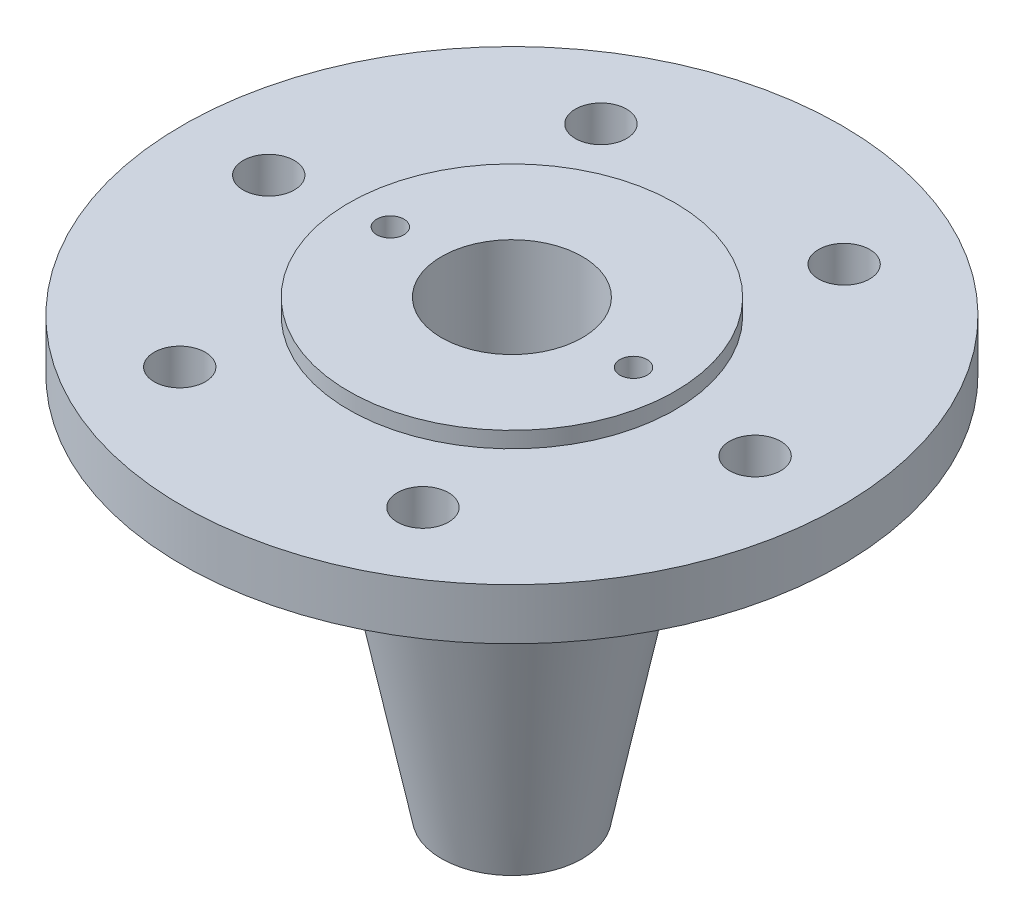
ISO-10303-21;
HEADER;
FILE_DESCRIPTION(('STEP AP214'),'2;1');
FILE_NAME('part.step','',(''),(''),'','','');
FILE_SCHEMA(('AUTOMOTIVE_DESIGN { 1 0 10303 214 1 1 1 1 }'));
ENDSEC;
DATA;
#1=APPLICATION_CONTEXT('core data for automotive mechanical design processes');
#2=APPLICATION_PROTOCOL_DEFINITION('international standard','automotive_design',2000,#1);
#3=PRODUCT_CONTEXT('',#1,'mechanical');
#4=PRODUCT('Part','Part','',(#3));
#5=PRODUCT_RELATED_PRODUCT_CATEGORY('part','',(#4));
#6=PRODUCT_DEFINITION_FORMATION('','',#4);
#7=PRODUCT_DEFINITION_CONTEXT('part definition',#1,'design');
#8=PRODUCT_DEFINITION('design','',#6,#7);
#9=PRODUCT_DEFINITION_SHAPE('','',#8);
#10=(LENGTH_UNIT() NAMED_UNIT(*) SI_UNIT(.MILLI.,.METRE.));
#11=(NAMED_UNIT(*) PLANE_ANGLE_UNIT() SI_UNIT($,.RADIAN.));
#12=(NAMED_UNIT(*) SI_UNIT($,.STERADIAN.) SOLID_ANGLE_UNIT());
#13=UNCERTAINTY_MEASURE_WITH_UNIT(LENGTH_MEASURE(1.E-05),#10,'distance_accuracy_value','');
#14=(GEOMETRIC_REPRESENTATION_CONTEXT(3) GLOBAL_UNCERTAINTY_ASSIGNED_CONTEXT((#13)) GLOBAL_UNIT_ASSIGNED_CONTEXT((#10,
#11,#12)) REPRESENTATION_CONTEXT('',''));
#15=CARTESIAN_POINT('',(0.,0.,0.));
#16=DIRECTION('',(0.,0.,1.));
#17=DIRECTION('',(1.,0.,0.));
#18=AXIS2_PLACEMENT_3D('',#15,#16,#17);
#19=CARTESIAN_POINT('',(0.,0.,0.));
#20=DIRECTION('',(0.,1.,0.));
#21=DIRECTION('',(0.,0.,1.));
#22=AXIS2_PLACEMENT_3D('',#19,#20,#21);
#23=PLANE('',#22);
#24=CARTESIAN_POINT('',(-38.,0.,0.));
#25=DIRECTION('',(0.,1.,0.));
#26=DIRECTION('',(0.,0.,1.));
#27=AXIS2_PLACEMENT_3D('',#24,#25,#26);
#28=CIRCLE('',#27,4.24999999999999);
#29=CARTESIAN_POINT('',(-38.,0.,4.24999999999999));
#30=VERTEX_POINT('',#29);
#31=EDGE_CURVE('E64',#30,#30,#28,.T.);
#32=ORIENTED_EDGE('',*,*,#31,.F.);
#33=EDGE_LOOP('',(#32));
#34=FACE_BOUND('',#33,.T.);
#35=CARTESIAN_POINT('',(38.,0.,0.));
#36=DIRECTION('',(0.,1.,0.));
#37=DIRECTION('',(0.,0.,1.));
#38=AXIS2_PLACEMENT_3D('',#35,#36,#37);
#39=CIRCLE('',#38,4.24999999999999);
#40=CARTESIAN_POINT('',(38.,0.,4.24999999999999));
#41=VERTEX_POINT('',#40);
#42=EDGE_CURVE('E63',#41,#41,#39,.T.);
#43=ORIENTED_EDGE('',*,*,#42,.F.);
#44=EDGE_LOOP('',(#43));
#45=FACE_BOUND('',#44,.T.);
#46=CARTESIAN_POINT('',(0.,0.,0.));
#47=DIRECTION('',(0.,1.,0.));
#48=DIRECTION('',(0.,0.,1.));
#49=AXIS2_PLACEMENT_3D('',#46,#47,#48);
#50=CIRCLE('',#49,22.);
#51=CARTESIAN_POINT('',(0.,0.,22.));
#52=VERTEX_POINT('',#51);
#53=EDGE_CURVE('E110',#52,#52,#50,.T.);
#54=ORIENTED_EDGE('',*,*,#53,.F.);
#55=EDGE_LOOP('',(#54));
#56=FACE_BOUND('',#55,.T.);
#57=CARTESIAN_POINT('',(0.,0.,0.));
#58=DIRECTION('',(0.,-1.,0.));
#59=DIRECTION('',(0.,0.,-1.));
#60=AXIS2_PLACEMENT_3D('',#57,#58,#59);
#61=CIRCLE('',#60,51.);
#62=CARTESIAN_POINT('',(0.,0.,-51.));
#63=VERTEX_POINT('',#62);
#64=EDGE_CURVE('E152',#63,#63,#61,.T.);
#65=ORIENTED_EDGE('',*,*,#64,.F.);
#66=EDGE_LOOP('',(#65));
#67=FACE_BOUND('',#66,.T.);
#68=ADVANCED_FACE('F39',(#34,#45,#56,#67),#23,.T.);
#69=CARTESIAN_POINT('',(0.,-141.,0.));
#70=DIRECTION('',(0.,-1.,0.));
#71=DIRECTION('',(0.,0.,-1.));
#72=AXIS2_PLACEMENT_3D('',#69,#70,#71);
#73=CYLINDRICAL_SURFACE('',#72,51.);
#74=ORIENTED_EDGE('',*,*,#64,.T.);
#75=EDGE_LOOP('',(#74));
#76=FACE_BOUND('',#75,.T.);
#77=CARTESIAN_POINT('',(0.,-5.,0.));
#78=DIRECTION('',(0.,-1.,0.));
#79=DIRECTION('',(0.,0.,-1.));
#80=AXIS2_PLACEMENT_3D('',#77,#78,#79);
#81=CIRCLE('',#80,51.);
#82=CARTESIAN_POINT('',(0.,-5.,-51.));
#83=VERTEX_POINT('',#82);
#84=EDGE_CURVE('E149',#83,#83,#81,.T.);
#85=ORIENTED_EDGE('',*,*,#84,.F.);
#86=EDGE_LOOP('',(#85));
#87=FACE_BOUND('',#86,.T.);
#88=ADVANCED_FACE('F176',(#76,#87),#73,.T.);
#89=CARTESIAN_POINT('',(51.,-5.,0.));
#90=DIRECTION('',(0.,1.,0.));
#91=DIRECTION('',(0.,0.,1.));
#92=AXIS2_PLACEMENT_3D('',#89,#90,#91);
#93=PLANE('',#92);
#94=CARTESIAN_POINT('',(-38.0000000000008,-5.,65.8179306876169));
#95=DIRECTION('',(0.,1.,0.));
#96=DIRECTION('',(0.,0.,1.));
#97=AXIS2_PLACEMENT_3D('',#94,#95,#96);
#98=CIRCLE('',#97,8.);
#99=CARTESIAN_POINT('',(-38.0000000000008,-5.,73.8179306876169));
#100=VERTEX_POINT('',#99);
#101=EDGE_CURVE('E74',#100,#100,#98,.T.);
#102=ORIENTED_EDGE('',*,*,#101,.F.);
#103=EDGE_LOOP('',(#102));
#104=FACE_BOUND('',#103,.T.);
#105=CARTESIAN_POINT('',(37.9999999999994,-5.,65.8179306876177));
#106=DIRECTION('',(0.,1.,0.));
#107=DIRECTION('',(0.,0.,1.));
#108=AXIS2_PLACEMENT_3D('',#105,#106,#107);
#109=CIRCLE('',#108,8.);
#110=CARTESIAN_POINT('',(37.9999999999994,-5.,73.8179306876177));
#111=VERTEX_POINT('',#110);
#112=EDGE_CURVE('E80',#111,#111,#109,.T.);
#113=ORIENTED_EDGE('',*,*,#112,.F.);
#114=EDGE_LOOP('',(#113));
#115=FACE_BOUND('',#114,.T.);
#116=CARTESIAN_POINT('',(76.,-5.,0.));
#117=DIRECTION('',(0.,1.,0.));
#118=DIRECTION('',(0.,0.,1.));
#119=AXIS2_PLACEMENT_3D('',#116,#117,#118);
#120=CIRCLE('',#119,7.99999999999999);
#121=CARTESIAN_POINT('',(76.,-5.,7.99999999999999));
#122=VERTEX_POINT('',#121);
#123=EDGE_CURVE('E86',#122,#122,#120,.T.);
#124=ORIENTED_EDGE('',*,*,#123,.F.);
#125=EDGE_LOOP('',(#124));
#126=FACE_BOUND('',#125,.T.);
#127=CARTESIAN_POINT('',(38.0000000000003,-5.,-65.8179306876172));
#128=DIRECTION('',(0.,1.,0.));
#129=DIRECTION('',(0.,0.,1.));
#130=AXIS2_PLACEMENT_3D('',#127,#128,#129);
#131=CIRCLE('',#130,8.);
#132=CARTESIAN_POINT('',(38.0000000000003,-5.,-57.8179306876172));
#133=VERTEX_POINT('',#132);
#134=EDGE_CURVE('E92',#133,#133,#131,.T.);
#135=ORIENTED_EDGE('',*,*,#134,.F.);
#136=EDGE_LOOP('',(#135));
#137=FACE_BOUND('',#136,.T.);
#138=CARTESIAN_POINT('',(-37.9999999999998,-5.,-65.8179306876174));
#139=DIRECTION('',(0.,1.,0.));
#140=DIRECTION('',(0.,0.,1.));
#141=AXIS2_PLACEMENT_3D('',#138,#139,#140);
#142=CIRCLE('',#141,8.);
#143=CARTESIAN_POINT('',(-37.9999999999998,-5.,-57.8179306876174));
#144=VERTEX_POINT('',#143);
#145=EDGE_CURVE('E98',#144,#144,#142,.T.);
#146=ORIENTED_EDGE('',*,*,#145,.F.);
#147=EDGE_LOOP('',(#146));
#148=FACE_BOUND('',#147,.T.);
#149=CARTESIAN_POINT('',(-76.,-5.,0.));
#150=DIRECTION('',(0.,1.,0.));
#151=DIRECTION('',(0.,0.,1.));
#152=AXIS2_PLACEMENT_3D('',#149,#150,#151);
#153=CIRCLE('',#152,7.99999999999999);
#154=CARTESIAN_POINT('',(-76.,-5.,7.99999999999999));
#155=VERTEX_POINT('',#154);
#156=EDGE_CURVE('E104',#155,#155,#153,.T.);
#157=ORIENTED_EDGE('',*,*,#156,.F.);
#158=EDGE_LOOP('',(#157));
#159=FACE_BOUND('',#158,.T.);
#160=ORIENTED_EDGE('',*,*,#84,.T.);
#161=EDGE_LOOP('',(#160));
#162=FACE_BOUND('',#161,.T.);
#163=CARTESIAN_POINT('',(0.,-5.,0.));
#164=DIRECTION('',(0.,-1.,0.));
#165=DIRECTION('',(0.,0.,-1.));
#166=AXIS2_PLACEMENT_3D('',#163,#164,#165);
#167=CIRCLE('',#166,103.);
#168=CARTESIAN_POINT('',(0.,-5.,-103.));
#169=VERTEX_POINT('',#168);
#170=EDGE_CURVE('E146',#169,#169,#167,.T.);
#171=ORIENTED_EDGE('',*,*,#170,.F.);
#172=EDGE_LOOP('',(#171));
#173=FACE_BOUND('',#172,.T.);
#174=ADVANCED_FACE('F181',(#104,#115,#126,#137,#148,#159,#162,#173),#93,.T.);
#175=CARTESIAN_POINT('',(0.,-141.,0.));
#176=DIRECTION('',(0.,-1.,0.));
#177=DIRECTION('',(0.,0.,-1.));
#178=AXIS2_PLACEMENT_3D('',#175,#176,#177);
#179=CYLINDRICAL_SURFACE('',#178,103.);
#180=ORIENTED_EDGE('',*,*,#170,.T.);
#181=EDGE_LOOP('',(#180));
#182=FACE_BOUND('',#181,.T.);
#183=CARTESIAN_POINT('',(0.,-21.,0.));
#184=DIRECTION('',(0.,-1.,0.));
#185=DIRECTION('',(0.,0.,-1.));
#186=AXIS2_PLACEMENT_3D('',#183,#184,#185);
#187=CIRCLE('',#186,103.);
#188=CARTESIAN_POINT('',(0.,-21.,-103.));
#189=VERTEX_POINT('',#188);
#190=EDGE_CURVE('E143',#189,#189,#187,.T.);
#191=ORIENTED_EDGE('',*,*,#190,.F.);
#192=EDGE_LOOP('',(#191));
#193=FACE_BOUND('',#192,.T.);
#194=ADVANCED_FACE('F189',(#182,#193),#179,.T.);
#195=CARTESIAN_POINT('',(103.,-21.,0.));
#196=DIRECTION('',(0.,-1.,0.));
#197=DIRECTION('',(0.,0.,-1.));
#198=AXIS2_PLACEMENT_3D('',#195,#196,#197);
#199=PLANE('',#198);
#200=CARTESIAN_POINT('',(-38.0000000000008,-21.,65.8179306876169));
#201=DIRECTION('',(0.,-1.,0.));
#202=DIRECTION('',(0.,0.,-1.));
#203=AXIS2_PLACEMENT_3D('',#200,#201,#202);
#204=CIRCLE('',#203,8.);
#205=CARTESIAN_POINT('',(-38.0000000000008,-21.,57.8179306876169));
#206=VERTEX_POINT('',#205);
#207=EDGE_CURVE('E77',#206,#206,#204,.T.);
#208=ORIENTED_EDGE('',*,*,#207,.F.);
#209=EDGE_LOOP('',(#208));
#210=FACE_BOUND('',#209,.T.);
#211=CARTESIAN_POINT('',(37.9999999999994,-21.,65.8179306876177));
#212=DIRECTION('',(0.,-1.,0.));
#213=DIRECTION('',(0.,0.,-1.));
#214=AXIS2_PLACEMENT_3D('',#211,#212,#213);
#215=CIRCLE('',#214,8.);
#216=CARTESIAN_POINT('',(37.9999999999994,-21.,57.8179306876177));
#217=VERTEX_POINT('',#216);
#218=EDGE_CURVE('E83',#217,#217,#215,.T.);
#219=ORIENTED_EDGE('',*,*,#218,.F.);
#220=EDGE_LOOP('',(#219));
#221=FACE_BOUND('',#220,.T.);
#222=CARTESIAN_POINT('',(76.,-21.,0.));
#223=DIRECTION('',(0.,-1.,0.));
#224=DIRECTION('',(0.,0.,-1.));
#225=AXIS2_PLACEMENT_3D('',#222,#223,#224);
#226=CIRCLE('',#225,7.99999999999999);
#227=CARTESIAN_POINT('',(76.,-21.,-7.99999999999999));
#228=VERTEX_POINT('',#227);
#229=EDGE_CURVE('E89',#228,#228,#226,.T.);
#230=ORIENTED_EDGE('',*,*,#229,.F.);
#231=EDGE_LOOP('',(#230));
#232=FACE_BOUND('',#231,.T.);
#233=CARTESIAN_POINT('',(38.0000000000003,-21.,-65.8179306876172));
#234=DIRECTION('',(0.,-1.,0.));
#235=DIRECTION('',(0.,0.,-1.));
#236=AXIS2_PLACEMENT_3D('',#233,#234,#235);
#237=CIRCLE('',#236,8.);
#238=CARTESIAN_POINT('',(38.0000000000003,-21.,-73.8179306876172));
#239=VERTEX_POINT('',#238);
#240=EDGE_CURVE('E95',#239,#239,#237,.T.);
#241=ORIENTED_EDGE('',*,*,#240,.F.);
#242=EDGE_LOOP('',(#241));
#243=FACE_BOUND('',#242,.T.);
#244=CARTESIAN_POINT('',(-37.9999999999998,-21.,-65.8179306876174));
#245=DIRECTION('',(0.,-1.,0.));
#246=DIRECTION('',(0.,0.,-1.));
#247=AXIS2_PLACEMENT_3D('',#244,#245,#246);
#248=CIRCLE('',#247,8.);
#249=CARTESIAN_POINT('',(-37.9999999999998,-21.,-73.8179306876174));
#250=VERTEX_POINT('',#249);
#251=EDGE_CURVE('E101',#250,#250,#248,.T.);
#252=ORIENTED_EDGE('',*,*,#251,.F.);
#253=EDGE_LOOP('',(#252));
#254=FACE_BOUND('',#253,.T.);
#255=CARTESIAN_POINT('',(-76.,-21.,0.));
#256=DIRECTION('',(0.,-1.,0.));
#257=DIRECTION('',(0.,0.,-1.));
#258=AXIS2_PLACEMENT_3D('',#255,#256,#257);
#259=CIRCLE('',#258,7.99999999999999);
#260=CARTESIAN_POINT('',(-76.,-21.,-7.99999999999999));
#261=VERTEX_POINT('',#260);
#262=EDGE_CURVE('E107',#261,#261,#259,.T.);
#263=ORIENTED_EDGE('',*,*,#262,.F.);
#264=EDGE_LOOP('',(#263));
#265=FACE_BOUND('',#264,.T.);
#266=ORIENTED_EDGE('',*,*,#190,.T.);
#267=EDGE_LOOP('',(#266));
#268=FACE_BOUND('',#267,.T.);
#269=CARTESIAN_POINT('',(0.,-21.,0.));
#270=DIRECTION('',(0.,-1.,0.));
#271=DIRECTION('',(0.,0.,-1.));
#272=AXIS2_PLACEMENT_3D('',#269,#270,#271);
#273=CIRCLE('',#272,54.);
#274=CARTESIAN_POINT('',(0.,-21.,-54.));
#275=VERTEX_POINT('',#274);
#276=EDGE_CURVE('E140',#275,#275,#273,.T.);
#277=ORIENTED_EDGE('',*,*,#276,.F.);
#278=EDGE_LOOP('',(#277));
#279=FACE_BOUND('',#278,.T.);
#280=ADVANCED_FACE('F193',(#210,#221,#232,#243,#254,#265,#268,#279),#199,.T.);
#281=CARTESIAN_POINT('',(0.,-141.,0.));
#282=DIRECTION('',(0.,-1.,0.));
#283=DIRECTION('',(0.,0.,-1.));
#284=AXIS2_PLACEMENT_3D('',#281,#282,#283);
#285=CYLINDRICAL_SURFACE('',#284,54.);
#286=ORIENTED_EDGE('',*,*,#276,.T.);
#287=EDGE_LOOP('',(#286));
#288=FACE_BOUND('',#287,.T.);
#289=CARTESIAN_POINT('',(0.,-31.,0.));
#290=DIRECTION('',(0.,-1.,0.));
#291=DIRECTION('',(0.,0.,-1.));
#292=AXIS2_PLACEMENT_3D('',#289,#290,#291);
#293=CIRCLE('',#292,54.);
#294=CARTESIAN_POINT('',(0.,-31.,-54.));
#295=VERTEX_POINT('',#294);
#296=EDGE_CURVE('E137',#295,#295,#293,.T.);
#297=ORIENTED_EDGE('',*,*,#296,.F.);
#298=EDGE_LOOP('',(#297));
#299=FACE_BOUND('',#298,.T.);
#300=ADVANCED_FACE('F197',(#288,#299),#285,.T.);
#301=CARTESIAN_POINT('',(54.,-31.,0.));
#302=DIRECTION('',(0.,-1.,0.));
#303=DIRECTION('',(0.,0.,-1.));
#304=AXIS2_PLACEMENT_3D('',#301,#302,#303);
#305=PLANE('',#304);
#306=CARTESIAN_POINT('',(0.,-31.,0.));
#307=DIRECTION('',(0.,-1.,0.));
#308=DIRECTION('',(0.,0.,-1.));
#309=AXIS2_PLACEMENT_3D('',#306,#307,#308);
#310=CIRCLE('',#309,48.0990195135928);
#311=CARTESIAN_POINT('',(0.,-31.,-48.0990195135928));
#312=VERTEX_POINT('',#311);
#313=EDGE_CURVE('E11',#312,#312,#310,.F.);
#314=ORIENTED_EDGE('',*,*,#313,.T.);
#315=EDGE_LOOP('',(#314));
#316=FACE_BOUND('',#315,.T.);
#317=ORIENTED_EDGE('',*,*,#296,.T.);
#318=EDGE_LOOP('',(#317));
#319=FACE_BOUND('',#318,.T.);
#320=ADVANCED_FACE('F201',(#316,#319),#305,.T.);
#321=CARTESIAN_POINT('',(0.,-141.,0.));
#322=DIRECTION('',(0.,1.,0.));
#323=DIRECTION('',(0.,0.,1.));
#324=AXIS2_PLACEMENT_3D('',#321,#322,#323);
#325=CONICAL_SURFACE('',#324,22.,0.197395559849881);
#326=CARTESIAN_POINT('',(0.,-35.0194193243091,0.));
#327=DIRECTION('',(0.,1.,0.));
#328=DIRECTION('',(0.,0.,1.));
#329=AXIS2_PLACEMENT_3D('',#326,#327,#328);
#330=CIRCLE('',#329,43.1961161351382);
#331=CARTESIAN_POINT('',(0.,-35.0194193243091,43.1961161351382));
#332=VERTEX_POINT('',#331);
#333=EDGE_CURVE('E47',#332,#332,#330,.F.);
#334=ORIENTED_EDGE('',*,*,#333,.T.);
#335=EDGE_LOOP('',(#334));
#336=FACE_BOUND('',#335,.T.);
#337=CARTESIAN_POINT('',(0.,-141.,0.));
#338=DIRECTION('',(0.,-1.,0.));
#339=DIRECTION('',(0.,0.,-1.));
#340=AXIS2_PLACEMENT_3D('',#337,#338,#339);
#341=CIRCLE('',#340,22.);
#342=CARTESIAN_POINT('',(0.,-141.,-22.));
#343=VERTEX_POINT('',#342);
#344=EDGE_CURVE('E134',#343,#343,#341,.T.);
#345=ORIENTED_EDGE('',*,*,#344,.F.);
#346=EDGE_LOOP('',(#345));
#347=FACE_BOUND('',#346,.T.);
#348=ADVANCED_FACE('F157',(#336,#347),#325,.T.);
#349=CARTESIAN_POINT('',(22.,-141.,0.));
#350=DIRECTION('',(0.,-1.,0.));
#351=DIRECTION('',(0.,0.,-1.));
#352=AXIS2_PLACEMENT_3D('',#349,#350,#351);
#353=PLANE('',#352);
#354=CARTESIAN_POINT('',(0.,-141.,0.));
#355=DIRECTION('',(0.,1.,0.));
#356=DIRECTION('',(0.,0.,1.));
#357=AXIS2_PLACEMENT_3D('',#354,#355,#356);
#358=CIRCLE('',#357,11.75);
#359=CARTESIAN_POINT('',(0.,-141.,11.75));
#360=VERTEX_POINT('',#359);
#361=EDGE_CURVE('E131',#360,#360,#358,.T.);
#362=ORIENTED_EDGE('',*,*,#361,.T.);
#363=EDGE_LOOP('',(#362));
#364=FACE_BOUND('',#363,.T.);
#365=ORIENTED_EDGE('',*,*,#344,.T.);
#366=EDGE_LOOP('',(#365));
#367=FACE_BOUND('',#366,.T.);
#368=ADVANCED_FACE('F208',(#364,#367),#353,.T.);
#369=CARTESIAN_POINT('',(0.,0.,0.));
#370=DIRECTION('',(0.,1.,0.));
#371=DIRECTION('',(0.,0.,1.));
#372=AXIS2_PLACEMENT_3D('',#369,#370,#371);
#373=CYLINDRICAL_SURFACE('',#372,11.75);
#374=ORIENTED_EDGE('',*,*,#361,.F.);
#375=EDGE_LOOP('',(#374));
#376=FACE_BOUND('',#375,.T.);
#377=CARTESIAN_POINT('',(0.,-103.,0.));
#378=DIRECTION('',(0.,1.,0.));
#379=DIRECTION('',(0.,0.,1.));
#380=AXIS2_PLACEMENT_3D('',#377,#378,#379);
#381=CIRCLE('',#380,11.75);
#382=CARTESIAN_POINT('',(0.,-103.,11.75));
#383=VERTEX_POINT('',#382);
#384=EDGE_CURVE('E128',#383,#383,#381,.T.);
#385=ORIENTED_EDGE('',*,*,#384,.T.);
#386=EDGE_LOOP('',(#385));
#387=FACE_BOUND('',#386,.T.);
#388=ADVANCED_FACE('F211',(#376,#387),#373,.F.);
#389=CARTESIAN_POINT('',(0.,-100.240017728911,0.));
#390=DIRECTION('',(0.,1.,0.));
#391=DIRECTION('',(0.,0.,1.));
#392=AXIS2_PLACEMENT_3D('',#389,#390,#391);
#393=CONICAL_SURFACE('',#392,16.,0.994837673636768);
#394=ORIENTED_EDGE('',*,*,#384,.F.);
#395=EDGE_LOOP('',(#394));
#396=FACE_BOUND('',#395,.T.);
#397=CARTESIAN_POINT('',(0.,-100.240017728911,0.));
#398=DIRECTION('',(0.,1.,0.));
#399=DIRECTION('',(0.,0.,1.));
#400=AXIS2_PLACEMENT_3D('',#397,#398,#399);
#401=CIRCLE('',#400,16.);
#402=CARTESIAN_POINT('',(0.,-100.240017728911,16.));
#403=VERTEX_POINT('',#402);
#404=EDGE_CURVE('E125',#403,#403,#401,.T.);
#405=ORIENTED_EDGE('',*,*,#404,.T.);
#406=EDGE_LOOP('',(#405));
#407=FACE_BOUND('',#406,.T.);
#408=ADVANCED_FACE('F215',(#396,#407),#393,.F.);
#409=CARTESIAN_POINT('',(0.,0.,0.));
#410=DIRECTION('',(0.,1.,0.));
#411=DIRECTION('',(0.,0.,1.));
#412=AXIS2_PLACEMENT_3D('',#409,#410,#411);
#413=CYLINDRICAL_SURFACE('',#412,16.);
#414=ORIENTED_EDGE('',*,*,#404,.F.);
#415=EDGE_LOOP('',(#414));
#416=FACE_BOUND('',#415,.T.);
#417=CARTESIAN_POINT('',(0.,-86.2470379659875,0.));
#418=DIRECTION('',(0.,1.,0.));
#419=DIRECTION('',(0.,0.,1.));
#420=AXIS2_PLACEMENT_3D('',#417,#418,#419);
#421=CIRCLE('',#420,16.);
#422=CARTESIAN_POINT('',(0.,-86.2470379659875,16.));
#423=VERTEX_POINT('',#422);
#424=EDGE_CURVE('E122',#423,#423,#421,.T.);
#425=ORIENTED_EDGE('',*,*,#424,.T.);
#426=EDGE_LOOP('',(#425));
#427=FACE_BOUND('',#426,.T.);
#428=ADVANCED_FACE('F219',(#416,#427),#413,.F.);
#429=CARTESIAN_POINT('',(0.,-83.,0.));
#430=DIRECTION('',(0.,-1.,0.));
#431=DIRECTION('',(0.,0.,-1.));
#432=AXIS2_PLACEMENT_3D('',#429,#430,#431);
#433=CONICAL_SURFACE('',#432,11.,0.994837673636774);
#434=ORIENTED_EDGE('',*,*,#424,.F.);
#435=EDGE_LOOP('',(#434));
#436=FACE_BOUND('',#435,.T.);
#437=CARTESIAN_POINT('',(0.,-83.,0.));
#438=DIRECTION('',(0.,1.,0.));
#439=DIRECTION('',(0.,0.,1.));
#440=AXIS2_PLACEMENT_3D('',#437,#438,#439);
#441=CIRCLE('',#440,11.);
#442=CARTESIAN_POINT('',(0.,-83.,11.));
#443=VERTEX_POINT('',#442);
#444=EDGE_CURVE('E119',#443,#443,#441,.T.);
#445=ORIENTED_EDGE('',*,*,#444,.T.);
#446=EDGE_LOOP('',(#445));
#447=FACE_BOUND('',#446,.T.);
#448=ADVANCED_FACE('F223',(#436,#447),#433,.F.);
#449=CARTESIAN_POINT('',(0.,0.,0.));
#450=DIRECTION('',(0.,1.,0.));
#451=DIRECTION('',(0.,0.,1.));
#452=AXIS2_PLACEMENT_3D('',#449,#450,#451);
#453=CYLINDRICAL_SURFACE('',#452,11.);
#454=ORIENTED_EDGE('',*,*,#444,.F.);
#455=EDGE_LOOP('',(#454));
#456=FACE_BOUND('',#455,.T.);
#457=CARTESIAN_POINT('',(0.,-51.1434835251725,0.));
#458=DIRECTION('',(0.,1.,0.));
#459=DIRECTION('',(0.,0.,1.));
#460=AXIS2_PLACEMENT_3D('',#457,#458,#459);
#461=CIRCLE('',#460,11.);
#462=CARTESIAN_POINT('',(0.,-51.1434835251725,11.));
#463=VERTEX_POINT('',#462);
#464=EDGE_CURVE('E116',#463,#463,#461,.T.);
#465=ORIENTED_EDGE('',*,*,#464,.T.);
#466=EDGE_LOOP('',(#465));
#467=FACE_BOUND('',#466,.T.);
#468=ADVANCED_FACE('F227',(#456,#467),#453,.F.);
#469=CARTESIAN_POINT('',(0.,-44.,0.));
#470=DIRECTION('',(0.,1.,0.));
#471=DIRECTION('',(0.,0.,1.));
#472=AXIS2_PLACEMENT_3D('',#469,#470,#471);
#473=CONICAL_SURFACE('',#472,22.,0.994837673636773);
#474=ORIENTED_EDGE('',*,*,#464,.F.);
#475=EDGE_LOOP('',(#474));
#476=FACE_BOUND('',#475,.T.);
#477=CARTESIAN_POINT('',(0.,-44.,0.));
#478=DIRECTION('',(0.,1.,0.));
#479=DIRECTION('',(0.,0.,1.));
#480=AXIS2_PLACEMENT_3D('',#477,#478,#479);
#481=CIRCLE('',#480,22.);
#482=CARTESIAN_POINT('',(0.,-44.,22.));
#483=VERTEX_POINT('',#482);
#484=EDGE_CURVE('E113',#483,#483,#481,.T.);
#485=ORIENTED_EDGE('',*,*,#484,.T.);
#486=EDGE_LOOP('',(#485));
#487=FACE_BOUND('',#486,.T.);
#488=ADVANCED_FACE('F171',(#476,#487),#473,.F.);
#489=CARTESIAN_POINT('',(0.,0.,0.));
#490=DIRECTION('',(0.,1.,0.));
#491=DIRECTION('',(0.,0.,1.));
#492=AXIS2_PLACEMENT_3D('',#489,#490,#491);
#493=CYLINDRICAL_SURFACE('',#492,22.);
#494=ORIENTED_EDGE('',*,*,#484,.F.);
#495=EDGE_LOOP('',(#494));
#496=FACE_BOUND('',#495,.T.);
#497=ORIENTED_EDGE('',*,*,#53,.T.);
#498=EDGE_LOOP('',(#497));
#499=FACE_BOUND('',#498,.T.);
#500=ADVANCED_FACE('F162',(#496,#499),#493,.F.);
#501=CARTESIAN_POINT('',(0.,-36.,0.));
#502=DIRECTION('',(0.,-1.,0.));
#503=DIRECTION('',(0.,0.,-1.));
#504=AXIS2_PLACEMENT_3D('',#501,#502,#503);
#505=TOROIDAL_SURFACE('',#504,48.0990195135928,5.);
#506=ORIENTED_EDGE('',*,*,#313,.F.);
#507=EDGE_LOOP('',(#506));
#508=FACE_BOUND('',#507,.T.);
#509=ORIENTED_EDGE('',*,*,#333,.F.);
#510=EDGE_LOOP('',(#509));
#511=FACE_BOUND('',#510,.T.);
#512=ADVANCED_FACE('F41',(#508,#511),#505,.F.);
#513=CARTESIAN_POINT('',(-76.,-5.,0.));
#514=DIRECTION('',(0.,1.,0.));
#515=DIRECTION('',(0.,0.,1.));
#516=AXIS2_PLACEMENT_3D('',#513,#514,#515);
#517=CYLINDRICAL_SURFACE('',#516,7.99999999999999);
#518=ORIENTED_EDGE('',*,*,#156,.T.);
#519=EDGE_LOOP('',(#518));
#520=FACE_BOUND('',#519,.T.);
#521=ORIENTED_EDGE('',*,*,#262,.T.);
#522=EDGE_LOOP('',(#521));
#523=FACE_BOUND('',#522,.T.);
#524=ADVANCED_FACE('F161',(#520,#523),#517,.F.);
#525=CARTESIAN_POINT('',(-37.9999999999998,-5.,-65.8179306876174));
#526=DIRECTION('',(0.,1.,0.));
#527=DIRECTION('',(0.,0.,1.));
#528=AXIS2_PLACEMENT_3D('',#525,#526,#527);
#529=CYLINDRICAL_SURFACE('',#528,8.);
#530=ORIENTED_EDGE('',*,*,#145,.T.);
#531=EDGE_LOOP('',(#530));
#532=FACE_BOUND('',#531,.T.);
#533=ORIENTED_EDGE('',*,*,#251,.T.);
#534=EDGE_LOOP('',(#533));
#535=FACE_BOUND('',#534,.T.);
#536=ADVANCED_FACE('F168',(#532,#535),#529,.F.);
#537=CARTESIAN_POINT('',(38.0000000000003,-5.,-65.8179306876172));
#538=DIRECTION('',(0.,1.,0.));
#539=DIRECTION('',(0.,0.,1.));
#540=AXIS2_PLACEMENT_3D('',#537,#538,#539);
#541=CYLINDRICAL_SURFACE('',#540,8.);
#542=ORIENTED_EDGE('',*,*,#134,.T.);
#543=EDGE_LOOP('',(#542));
#544=FACE_BOUND('',#543,.T.);
#545=ORIENTED_EDGE('',*,*,#240,.T.);
#546=EDGE_LOOP('',(#545));
#547=FACE_BOUND('',#546,.T.);
#548=ADVANCED_FACE('F237',(#544,#547),#541,.F.);
#549=CARTESIAN_POINT('',(76.,-5.,0.));
#550=DIRECTION('',(0.,1.,0.));
#551=DIRECTION('',(0.,0.,1.));
#552=AXIS2_PLACEMENT_3D('',#549,#550,#551);
#553=CYLINDRICAL_SURFACE('',#552,7.99999999999999);
#554=ORIENTED_EDGE('',*,*,#123,.T.);
#555=EDGE_LOOP('',(#554));
#556=FACE_BOUND('',#555,.T.);
#557=ORIENTED_EDGE('',*,*,#229,.T.);
#558=EDGE_LOOP('',(#557));
#559=FACE_BOUND('',#558,.T.);
#560=ADVANCED_FACE('F241',(#556,#559),#553,.F.);
#561=CARTESIAN_POINT('',(37.9999999999994,-5.,65.8179306876177));
#562=DIRECTION('',(0.,1.,0.));
#563=DIRECTION('',(0.,0.,1.));
#564=AXIS2_PLACEMENT_3D('',#561,#562,#563);
#565=CYLINDRICAL_SURFACE('',#564,8.);
#566=ORIENTED_EDGE('',*,*,#112,.T.);
#567=EDGE_LOOP('',(#566));
#568=FACE_BOUND('',#567,.T.);
#569=ORIENTED_EDGE('',*,*,#218,.T.);
#570=EDGE_LOOP('',(#569));
#571=FACE_BOUND('',#570,.T.);
#572=ADVANCED_FACE('F245',(#568,#571),#565,.F.);
#573=CARTESIAN_POINT('',(-38.0000000000008,-5.,65.8179306876169));
#574=DIRECTION('',(0.,1.,0.));
#575=DIRECTION('',(0.,0.,1.));
#576=AXIS2_PLACEMENT_3D('',#573,#574,#575);
#577=CYLINDRICAL_SURFACE('',#576,8.);
#578=ORIENTED_EDGE('',*,*,#101,.T.);
#579=EDGE_LOOP('',(#578));
#580=FACE_BOUND('',#579,.T.);
#581=ORIENTED_EDGE('',*,*,#207,.T.);
#582=EDGE_LOOP('',(#581));
#583=FACE_BOUND('',#582,.T.);
#584=ADVANCED_FACE('F249',(#580,#583),#577,.F.);
#585=CARTESIAN_POINT('',(38.,-18.,0.));
#586=DIRECTION('',(0.,1.,0.));
#587=DIRECTION('',(0.,0.,1.));
#588=AXIS2_PLACEMENT_3D('',#585,#586,#587);
#589=CONICAL_SURFACE('',#588,4.25,1.02974425867665);
#590=CARTESIAN_POINT('',(38.,-20.5536576308671,0.));
#591=VERTEX_POINT('',#590);
#592=VERTEX_LOOP('',#591);
#593=FACE_BOUND('',#592,.T.);
#594=CARTESIAN_POINT('',(38.,-18.,0.));
#595=DIRECTION('',(0.,1.,0.));
#596=DIRECTION('',(0.,0.,1.));
#597=AXIS2_PLACEMENT_3D('',#594,#595,#596);
#598=CIRCLE('',#597,4.25);
#599=CARTESIAN_POINT('',(38.,-18.,4.25));
#600=VERTEX_POINT('',#599);
#601=EDGE_CURVE('E67',#600,#600,#598,.T.);
#602=ORIENTED_EDGE('',*,*,#601,.T.);
#603=EDGE_LOOP('',(#602));
#604=FACE_BOUND('',#603,.T.);
#605=ADVANCED_FACE('F253',(#593,#604),#589,.F.);
#606=CARTESIAN_POINT('',(38.,0.,0.));
#607=DIRECTION('',(0.,1.,0.));
#608=DIRECTION('',(0.,0.,1.));
#609=AXIS2_PLACEMENT_3D('',#606,#607,#608);
#610=CYLINDRICAL_SURFACE('',#609,4.24999999999999);
#611=ORIENTED_EDGE('',*,*,#601,.F.);
#612=EDGE_LOOP('',(#611));
#613=FACE_BOUND('',#612,.T.);
#614=ORIENTED_EDGE('',*,*,#42,.T.);
#615=EDGE_LOOP('',(#614));
#616=FACE_BOUND('',#615,.T.);
#617=ADVANCED_FACE('F57',(#613,#616),#610,.F.);
#618=CARTESIAN_POINT('',(-38.,-18.,0.));
#619=DIRECTION('',(0.,1.,0.));
#620=DIRECTION('',(0.,0.,1.));
#621=AXIS2_PLACEMENT_3D('',#618,#619,#620);
#622=CONICAL_SURFACE('',#621,4.25,1.02974425867665);
#623=CARTESIAN_POINT('',(-38.,-20.5536576308671,0.));
#624=VERTEX_POINT('',#623);
#625=VERTEX_LOOP('',#624);
#626=FACE_BOUND('',#625,.T.);
#627=CARTESIAN_POINT('',(-38.,-18.,0.));
#628=DIRECTION('',(0.,1.,0.));
#629=DIRECTION('',(0.,0.,1.));
#630=AXIS2_PLACEMENT_3D('',#627,#628,#629);
#631=CIRCLE('',#630,4.25);
#632=CARTESIAN_POINT('',(-38.,-18.,4.25));
#633=VERTEX_POINT('',#632);
#634=EDGE_CURVE('E61',#633,#633,#631,.T.);
#635=ORIENTED_EDGE('',*,*,#634,.T.);
#636=EDGE_LOOP('',(#635));
#637=FACE_BOUND('',#636,.T.);
#638=ADVANCED_FACE('F53',(#626,#637),#622,.F.);
#639=CARTESIAN_POINT('',(-38.,0.,0.));
#640=DIRECTION('',(0.,1.,0.));
#641=DIRECTION('',(0.,0.,1.));
#642=AXIS2_PLACEMENT_3D('',#639,#640,#641);
#643=CYLINDRICAL_SURFACE('',#642,4.24999999999999);
#644=ORIENTED_EDGE('',*,*,#634,.F.);
#645=EDGE_LOOP('',(#644));
#646=FACE_BOUND('',#645,.T.);
#647=ORIENTED_EDGE('',*,*,#31,.T.);
#648=EDGE_LOOP('',(#647));
#649=FACE_BOUND('',#648,.T.);
#650=ADVANCED_FACE('F56',(#646,#649),#643,.F.);
#651=CLOSED_SHELL('',(#68,#88,#174,#194,#280,#300,#320,#348,#368,#388,#408,#428,#448,#468,#488,
#500,#512,#524,#536,#548,#560,#572,#584,#605,#617,#638,#650));
#652=MANIFOLD_SOLID_BREP('B2',#651);
#653=ADVANCED_BREP_SHAPE_REPRESENTATION('',(#18,#652),#14);
#654=SHAPE_DEFINITION_REPRESENTATION(#9,#653);
ENDSEC;
END-ISO-10303-21;
